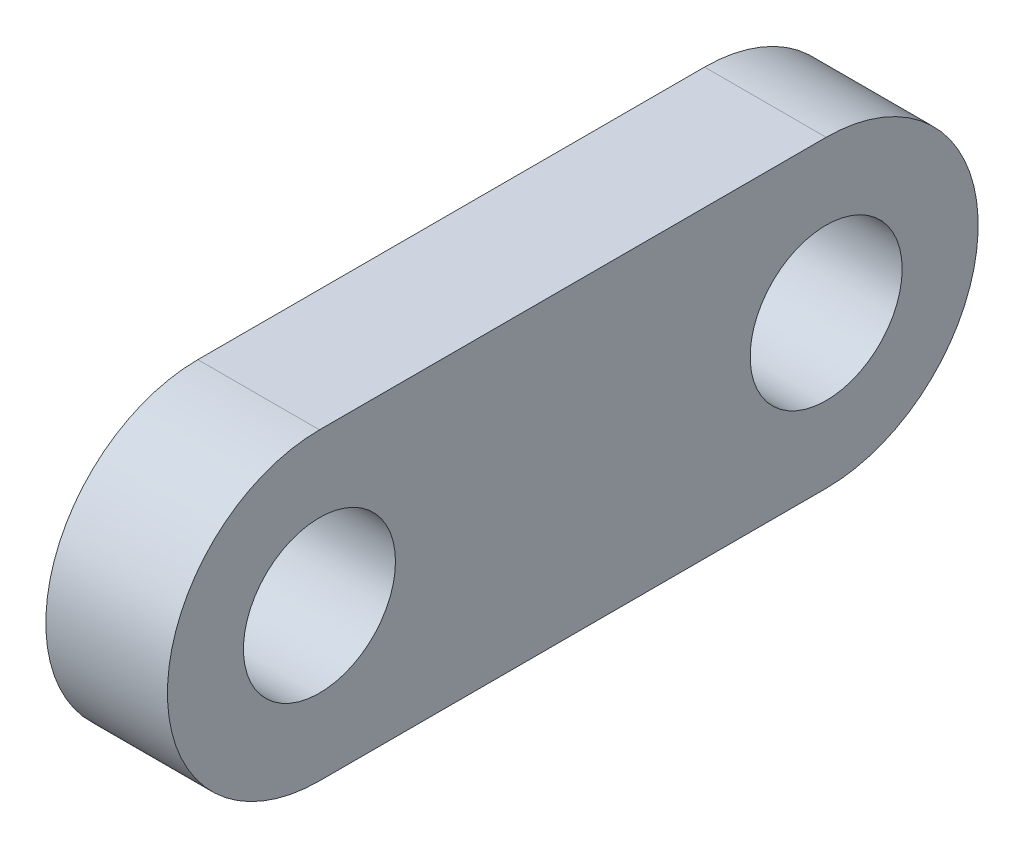
ISO-10303-21;
HEADER;
FILE_DESCRIPTION(('STEP AP214'),'2;1');
FILE_NAME('part.step','',(''),(''),'','','');
FILE_SCHEMA(('AUTOMOTIVE_DESIGN { 1 0 10303 214 1 1 1 1 }'));
ENDSEC;
DATA;
#1=APPLICATION_CONTEXT('core data for automotive mechanical design processes');
#2=APPLICATION_PROTOCOL_DEFINITION('international standard','automotive_design',2000,#1);
#3=PRODUCT_CONTEXT('',#1,'mechanical');
#4=PRODUCT('Part','Part','',(#3));
#5=PRODUCT_RELATED_PRODUCT_CATEGORY('part','',(#4));
#6=PRODUCT_DEFINITION_FORMATION('','',#4);
#7=PRODUCT_DEFINITION_CONTEXT('part definition',#1,'design');
#8=PRODUCT_DEFINITION('design','',#6,#7);
#9=PRODUCT_DEFINITION_SHAPE('','',#8);
#10=(LENGTH_UNIT() NAMED_UNIT(*) SI_UNIT(.MILLI.,.METRE.));
#11=(NAMED_UNIT(*) PLANE_ANGLE_UNIT() SI_UNIT($,.RADIAN.));
#12=(NAMED_UNIT(*) SI_UNIT($,.STERADIAN.) SOLID_ANGLE_UNIT());
#13=UNCERTAINTY_MEASURE_WITH_UNIT(LENGTH_MEASURE(1.E-05),#10,'distance_accuracy_value','');
#14=(GEOMETRIC_REPRESENTATION_CONTEXT(3) GLOBAL_UNCERTAINTY_ASSIGNED_CONTEXT((#13)) GLOBAL_UNIT_ASSIGNED_CONTEXT((#10,
#11,#12)) REPRESENTATION_CONTEXT('',''));
#15=CARTESIAN_POINT('',(0.,0.,0.));
#16=DIRECTION('',(0.,0.,1.));
#17=DIRECTION('',(1.,0.,0.));
#18=AXIS2_PLACEMENT_3D('',#15,#16,#17);
#19=CARTESIAN_POINT('',(12.,0.,0.));
#20=DIRECTION('',(1.,0.,0.));
#21=DIRECTION('',(0.,0.,-1.));
#22=AXIS2_PLACEMENT_3D('',#19,#20,#21);
#23=PLANE('',#22);
#24=CARTESIAN_POINT('',(12.,0.,0.));
#25=DIRECTION('',(1.,0.,0.));
#26=DIRECTION('',(0.,0.,-1.));
#27=AXIS2_PLACEMENT_3D('',#24,#25,#26);
#28=CIRCLE('',#27,7.5);
#29=CARTESIAN_POINT('',(12.,0.,-7.5));
#30=VERTEX_POINT('',#29);
#31=EDGE_CURVE('E101',#30,#30,#28,.T.);
#32=ORIENTED_EDGE('',*,*,#31,.F.);
#33=EDGE_LOOP('',(#32));
#34=FACE_BOUND('',#33,.T.);
#35=CARTESIAN_POINT('',(12.,0.,0.));
#36=DIRECTION('',(1.,0.,0.));
#37=DIRECTION('',(0.,0.,-1.));
#38=AXIS2_PLACEMENT_3D('',#35,#36,#37);
#39=CIRCLE('',#38,15.);
#40=CARTESIAN_POINT('',(12.,15.,0.));
#41=VERTEX_POINT('',#40);
#42=CARTESIAN_POINT('',(12.,-15.,0.));
#43=VERTEX_POINT('',#42);
#44=EDGE_CURVE('E86',#41,#43,#39,.T.);
#45=ORIENTED_EDGE('',*,*,#44,.T.);
#46=DIRECTION('',(0.,0.,-1.));
#47=VECTOR('',#46,1.);
#48=CARTESIAN_POINT('',(12.,-15.,0.));
#49=LINE('',#48,#47);
#50=CARTESIAN_POINT('',(12.,-15.,-50.));
#51=VERTEX_POINT('',#50);
#52=EDGE_CURVE('E81',#43,#51,#49,.T.);
#53=ORIENTED_EDGE('',*,*,#52,.T.);
#54=CARTESIAN_POINT('',(12.,0.,-50.));
#55=DIRECTION('',(1.,0.,0.));
#56=DIRECTION('',(0.,0.,-1.));
#57=AXIS2_PLACEMENT_3D('',#54,#55,#56);
#58=CIRCLE('',#57,15.);
#59=CARTESIAN_POINT('',(12.,15.,-50.));
#60=VERTEX_POINT('',#59);
#61=EDGE_CURVE('E84',#51,#60,#58,.T.);
#62=ORIENTED_EDGE('',*,*,#61,.T.);
#63=DIRECTION('',(0.,0.,1.));
#64=VECTOR('',#63,1.);
#65=CARTESIAN_POINT('',(12.,15.,0.));
#66=LINE('',#65,#64);
#67=EDGE_CURVE('E51',#60,#41,#66,.T.);
#68=ORIENTED_EDGE('',*,*,#67,.T.);
#69=EDGE_LOOP('',(#45,#53,#62,#68));
#70=FACE_BOUND('',#69,.T.);
#71=CARTESIAN_POINT('',(12.,0.,-50.));
#72=DIRECTION('',(1.,0.,0.));
#73=DIRECTION('',(0.,0.,-1.));
#74=AXIS2_PLACEMENT_3D('',#71,#72,#73);
#75=CIRCLE('',#74,7.5);
#76=CARTESIAN_POINT('',(12.,0.,-57.5));
#77=VERTEX_POINT('',#76);
#78=EDGE_CURVE('E116',#77,#77,#75,.T.);
#79=ORIENTED_EDGE('',*,*,#78,.F.);
#80=EDGE_LOOP('',(#79));
#81=FACE_BOUND('',#80,.T.);
#82=ADVANCED_FACE('F34',(#34,#70,#81),#23,.T.);
#83=CARTESIAN_POINT('',(0.,0.,0.));
#84=DIRECTION('',(1.,0.,0.));
#85=DIRECTION('',(0.,0.,-1.));
#86=AXIS2_PLACEMENT_3D('',#83,#84,#85);
#87=PLANE('',#86);
#88=CARTESIAN_POINT('',(0.,0.,0.));
#89=DIRECTION('',(1.,0.,0.));
#90=DIRECTION('',(0.,0.,-1.));
#91=AXIS2_PLACEMENT_3D('',#88,#89,#90);
#92=CIRCLE('',#91,15.);
#93=CARTESIAN_POINT('',(0.,15.,0.));
#94=VERTEX_POINT('',#93);
#95=CARTESIAN_POINT('',(0.,-15.,0.));
#96=VERTEX_POINT('',#95);
#97=EDGE_CURVE('E98',#94,#96,#92,.T.);
#98=ORIENTED_EDGE('',*,*,#97,.F.);
#99=DIRECTION('',(0.,0.,1.));
#100=VECTOR('',#99,1.);
#101=CARTESIAN_POINT('',(0.,15.,0.));
#102=LINE('',#101,#100);
#103=CARTESIAN_POINT('',(0.,15.,-50.));
#104=VERTEX_POINT('',#103);
#105=EDGE_CURVE('E74',#104,#94,#102,.T.);
#106=ORIENTED_EDGE('',*,*,#105,.F.);
#107=CARTESIAN_POINT('',(0.,0.,-50.));
#108=DIRECTION('',(1.,0.,0.));
#109=DIRECTION('',(0.,0.,-1.));
#110=AXIS2_PLACEMENT_3D('',#107,#108,#109);
#111=CIRCLE('',#110,15.);
#112=CARTESIAN_POINT('',(0.,-15.,-50.));
#113=VERTEX_POINT('',#112);
#114=EDGE_CURVE('E68',#113,#104,#111,.T.);
#115=ORIENTED_EDGE('',*,*,#114,.F.);
#116=DIRECTION('',(0.,0.,-1.));
#117=VECTOR('',#116,1.);
#118=CARTESIAN_POINT('',(0.,-15.,0.));
#119=LINE('',#118,#117);
#120=EDGE_CURVE('E90',#96,#113,#119,.T.);
#121=ORIENTED_EDGE('',*,*,#120,.F.);
#122=EDGE_LOOP('',(#98,#106,#115,#121));
#123=FACE_BOUND('',#122,.T.);
#124=CARTESIAN_POINT('',(0.,0.,0.));
#125=DIRECTION('',(1.,0.,0.));
#126=DIRECTION('',(0.,0.,-1.));
#127=AXIS2_PLACEMENT_3D('',#124,#125,#126);
#128=CIRCLE('',#127,7.5);
#129=CARTESIAN_POINT('',(0.,0.,-7.5));
#130=VERTEX_POINT('',#129);
#131=EDGE_CURVE('E113',#130,#130,#128,.T.);
#132=ORIENTED_EDGE('',*,*,#131,.T.);
#133=EDGE_LOOP('',(#132));
#134=FACE_BOUND('',#133,.T.);
#135=CARTESIAN_POINT('',(0.,0.,-50.));
#136=DIRECTION('',(1.,0.,0.));
#137=DIRECTION('',(0.,0.,-1.));
#138=AXIS2_PLACEMENT_3D('',#135,#136,#137);
#139=CIRCLE('',#138,7.5);
#140=CARTESIAN_POINT('',(0.,0.,-57.5));
#141=VERTEX_POINT('',#140);
#142=EDGE_CURVE('E119',#141,#141,#139,.T.);
#143=ORIENTED_EDGE('',*,*,#142,.T.);
#144=EDGE_LOOP('',(#143));
#145=FACE_BOUND('',#144,.T.);
#146=ADVANCED_FACE('F109',(#123,#134,#145),#87,.F.);
#147=CARTESIAN_POINT('',(12.,0.,0.));
#148=DIRECTION('',(-1.,0.,0.));
#149=DIRECTION('',(0.,0.,1.));
#150=AXIS2_PLACEMENT_3D('',#147,#148,#149);
#151=CYLINDRICAL_SURFACE('',#150,15.);
#152=ORIENTED_EDGE('',*,*,#97,.T.);
#153=DIRECTION('',(-1.,0.,0.));
#154=VECTOR('',#153,1.);
#155=CARTESIAN_POINT('',(12.,-15.,0.));
#156=LINE('',#155,#154);
#157=EDGE_CURVE('E11',#43,#96,#156,.T.);
#158=ORIENTED_EDGE('',*,*,#157,.F.);
#159=ORIENTED_EDGE('',*,*,#44,.F.);
#160=DIRECTION('',(-1.,0.,0.));
#161=VECTOR('',#160,1.);
#162=CARTESIAN_POINT('',(12.,15.,0.));
#163=LINE('',#162,#161);
#164=EDGE_CURVE('E94',#41,#94,#163,.T.);
#165=ORIENTED_EDGE('',*,*,#164,.T.);
#166=EDGE_LOOP('',(#152,#158,#159,#165));
#167=FACE_BOUND('',#166,.T.);
#168=ADVANCED_FACE('F36',(#167),#151,.T.);
#169=CARTESIAN_POINT('',(12.,-15.,0.));
#170=DIRECTION('',(0.,1.,0.));
#171=DIRECTION('',(0.,0.,1.));
#172=AXIS2_PLACEMENT_3D('',#169,#170,#171);
#173=PLANE('',#172);
#174=ORIENTED_EDGE('',*,*,#120,.T.);
#175=DIRECTION('',(-1.,0.,0.));
#176=VECTOR('',#175,1.);
#177=CARTESIAN_POINT('',(12.,-15.,-50.));
#178=LINE('',#177,#176);
#179=EDGE_CURVE('E43',#51,#113,#178,.T.);
#180=ORIENTED_EDGE('',*,*,#179,.F.);
#181=ORIENTED_EDGE('',*,*,#52,.F.);
#182=ORIENTED_EDGE('',*,*,#157,.T.);
#183=EDGE_LOOP('',(#174,#180,#181,#182));
#184=FACE_BOUND('',#183,.T.);
#185=ADVANCED_FACE('F89',(#184),#173,.F.);
#186=CARTESIAN_POINT('',(12.,0.,-50.));
#187=DIRECTION('',(-1.,0.,0.));
#188=DIRECTION('',(0.,0.,1.));
#189=AXIS2_PLACEMENT_3D('',#186,#187,#188);
#190=CYLINDRICAL_SURFACE('',#189,15.);
#191=ORIENTED_EDGE('',*,*,#114,.T.);
#192=DIRECTION('',(-1.,0.,0.));
#193=VECTOR('',#192,1.);
#194=CARTESIAN_POINT('',(12.,15.,-50.));
#195=LINE('',#194,#193);
#196=EDGE_CURVE('E91',#60,#104,#195,.T.);
#197=ORIENTED_EDGE('',*,*,#196,.F.);
#198=ORIENTED_EDGE('',*,*,#61,.F.);
#199=ORIENTED_EDGE('',*,*,#179,.T.);
#200=EDGE_LOOP('',(#191,#197,#198,#199));
#201=FACE_BOUND('',#200,.T.);
#202=ADVANCED_FACE('F92',(#201),#190,.T.);
#203=CARTESIAN_POINT('',(12.,15.,0.));
#204=DIRECTION('',(0.,-1.,0.));
#205=DIRECTION('',(0.,0.,-1.));
#206=AXIS2_PLACEMENT_3D('',#203,#204,#205);
#207=PLANE('',#206);
#208=ORIENTED_EDGE('',*,*,#105,.T.);
#209=ORIENTED_EDGE('',*,*,#164,.F.);
#210=ORIENTED_EDGE('',*,*,#67,.F.);
#211=ORIENTED_EDGE('',*,*,#196,.T.);
#212=EDGE_LOOP('',(#208,#209,#210,#211));
#213=FACE_BOUND('',#212,.T.);
#214=ADVANCED_FACE('F106',(#213),#207,.F.);
#215=CARTESIAN_POINT('',(12.,0.,0.));
#216=DIRECTION('',(-1.,0.,0.));
#217=DIRECTION('',(0.,0.,1.));
#218=AXIS2_PLACEMENT_3D('',#215,#216,#217);
#219=CYLINDRICAL_SURFACE('',#218,7.5);
#220=ORIENTED_EDGE('',*,*,#31,.T.);
#221=EDGE_LOOP('',(#220));
#222=FACE_BOUND('',#221,.T.);
#223=ORIENTED_EDGE('',*,*,#131,.F.);
#224=EDGE_LOOP('',(#223));
#225=FACE_BOUND('',#224,.T.);
#226=ADVANCED_FACE('F136',(#222,#225),#219,.F.);
#227=CARTESIAN_POINT('',(12.,0.,-50.));
#228=DIRECTION('',(-1.,0.,0.));
#229=DIRECTION('',(0.,0.,1.));
#230=AXIS2_PLACEMENT_3D('',#227,#228,#229);
#231=CYLINDRICAL_SURFACE('',#230,7.5);
#232=ORIENTED_EDGE('',*,*,#78,.T.);
#233=EDGE_LOOP('',(#232));
#234=FACE_BOUND('',#233,.T.);
#235=ORIENTED_EDGE('',*,*,#142,.F.);
#236=EDGE_LOOP('',(#235));
#237=FACE_BOUND('',#236,.T.);
#238=ADVANCED_FACE('F125',(#234,#237),#231,.F.);
#239=CLOSED_SHELL('',(#82,#146,#168,#185,#202,#214,#226,#238));
#240=MANIFOLD_SOLID_BREP('B2',#239);
#241=ADVANCED_BREP_SHAPE_REPRESENTATION('',(#18,#240),#14);
#242=SHAPE_DEFINITION_REPRESENTATION(#9,#241);
ENDSEC;
END-ISO-10303-21;
